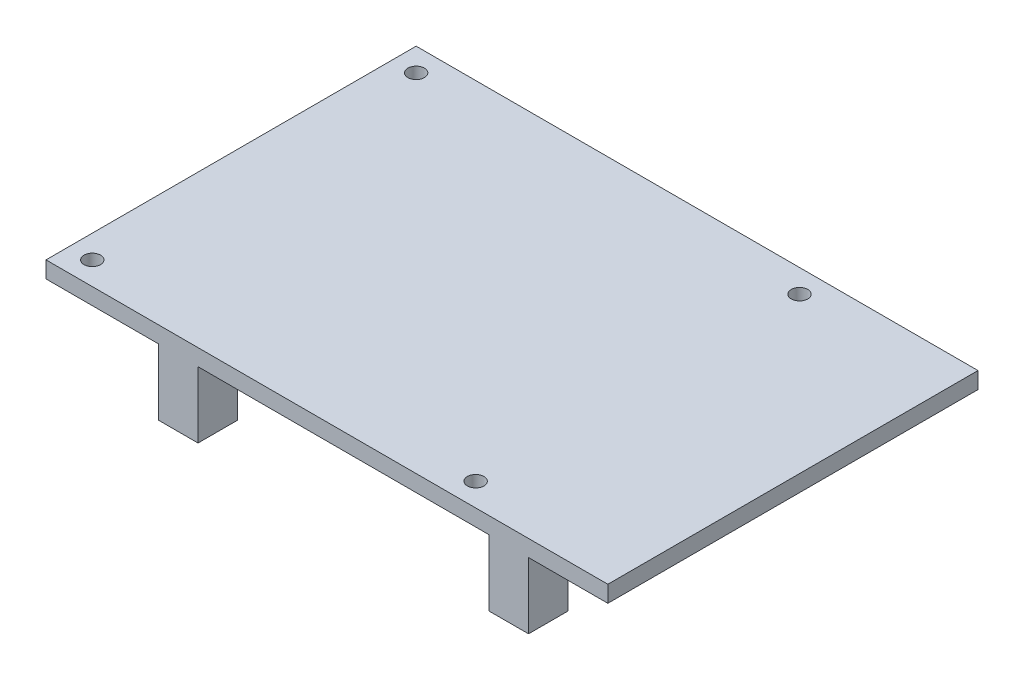
ISO-10303-21;
HEADER;
FILE_DESCRIPTION(('STEP AP214'),'2;1');
FILE_NAME('part.step','',(''),(''),'','','');
FILE_SCHEMA(('AUTOMOTIVE_DESIGN { 1 0 10303 214 1 1 1 1 }'));
ENDSEC;
DATA;
#1=APPLICATION_CONTEXT('core data for automotive mechanical design processes');
#2=APPLICATION_PROTOCOL_DEFINITION('international standard','automotive_design',2000,#1);
#3=PRODUCT_CONTEXT('',#1,'mechanical');
#4=PRODUCT('Part','Part','',(#3));
#5=PRODUCT_RELATED_PRODUCT_CATEGORY('part','',(#4));
#6=PRODUCT_DEFINITION_FORMATION('','',#4);
#7=PRODUCT_DEFINITION_CONTEXT('part definition',#1,'design');
#8=PRODUCT_DEFINITION('design','',#6,#7);
#9=PRODUCT_DEFINITION_SHAPE('','',#8);
#10=(LENGTH_UNIT() NAMED_UNIT(*) SI_UNIT(.MILLI.,.METRE.));
#11=(NAMED_UNIT(*) PLANE_ANGLE_UNIT() SI_UNIT($,.RADIAN.));
#12=(NAMED_UNIT(*) SI_UNIT($,.STERADIAN.) SOLID_ANGLE_UNIT());
#13=UNCERTAINTY_MEASURE_WITH_UNIT(LENGTH_MEASURE(1.E-05),#10,'distance_accuracy_value','');
#14=(GEOMETRIC_REPRESENTATION_CONTEXT(3) GLOBAL_UNCERTAINTY_ASSIGNED_CONTEXT((#13)) GLOBAL_UNIT_ASSIGNED_CONTEXT((#10,
#11,#12)) REPRESENTATION_CONTEXT('',''));
#15=CARTESIAN_POINT('',(0.,0.,0.));
#16=DIRECTION('',(0.,0.,1.));
#17=DIRECTION('',(1.,0.,0.));
#18=AXIS2_PLACEMENT_3D('',#15,#16,#17);
#19=CARTESIAN_POINT('',(0.,0.,0.));
#20=DIRECTION('',(0.,1.,0.));
#21=DIRECTION('',(0.,0.,1.));
#22=AXIS2_PLACEMENT_3D('',#19,#20,#21);
#23=PLANE('',#22);
#24=CARTESIAN_POINT('',(61.5,0.,3.5));
#25=DIRECTION('',(0.,1.,0.));
#26=DIRECTION('',(0.,0.,1.));
#27=AXIS2_PLACEMENT_3D('',#24,#25,#26);
#28=CIRCLE('',#27,1.25);
#29=CARTESIAN_POINT('',(61.5,0.,4.75));
#30=VERTEX_POINT('',#29);
#31=EDGE_CURVE('E391',#30,#30,#28,.T.);
#32=ORIENTED_EDGE('',*,*,#31,.T.);
#33=EDGE_LOOP('',(#32));
#34=FACE_BOUND('',#33,.T.);
#35=CARTESIAN_POINT('',(61.5,0.,52.5));
#36=DIRECTION('',(0.,1.,0.));
#37=DIRECTION('',(0.,0.,1.));
#38=AXIS2_PLACEMENT_3D('',#35,#36,#37);
#39=CIRCLE('',#38,1.25);
#40=CARTESIAN_POINT('',(61.5,0.,53.75));
#41=VERTEX_POINT('',#40);
#42=EDGE_CURVE('E399',#41,#41,#39,.T.);
#43=ORIENTED_EDGE('',*,*,#42,.T.);
#44=EDGE_LOOP('',(#43));
#45=FACE_BOUND('',#44,.T.);
#46=CARTESIAN_POINT('',(3.50000000000001,0.,52.5));
#47=DIRECTION('',(0.,1.,0.));
#48=DIRECTION('',(0.,0.,1.));
#49=AXIS2_PLACEMENT_3D('',#46,#47,#48);
#50=CIRCLE('',#49,1.25);
#51=CARTESIAN_POINT('',(3.50000000000001,0.,53.75));
#52=VERTEX_POINT('',#51);
#53=EDGE_CURVE('E407',#52,#52,#50,.T.);
#54=ORIENTED_EDGE('',*,*,#53,.T.);
#55=EDGE_LOOP('',(#54));
#56=FACE_BOUND('',#55,.T.);
#57=CARTESIAN_POINT('',(3.5,0.,3.5));
#58=DIRECTION('',(0.,1.,0.));
#59=DIRECTION('',(0.,0.,1.));
#60=AXIS2_PLACEMENT_3D('',#57,#58,#59);
#61=CIRCLE('',#60,1.25);
#62=CARTESIAN_POINT('',(3.5,0.,4.75));
#63=VERTEX_POINT('',#62);
#64=EDGE_CURVE('E415',#63,#63,#61,.T.);
#65=ORIENTED_EDGE('',*,*,#64,.T.);
#66=EDGE_LOOP('',(#65));
#67=FACE_BOUND('',#66,.T.);
#68=DIRECTION('',(1.,0.,0.));
#69=VECTOR('',#68,1.);
#70=CARTESIAN_POINT('',(0.,0.,56.));
#71=LINE('',#70,#69);
#72=CARTESIAN_POINT('',(23.,0.,56.));
#73=VERTEX_POINT('',#72);
#74=CARTESIAN_POINT('',(67.,0.,56.));
#75=VERTEX_POINT('',#74);
#76=EDGE_CURVE('E444',#73,#75,#71,.T.);
#77=ORIENTED_EDGE('',*,*,#76,.F.);
#78=DIRECTION('',(0.,0.,-1.));
#79=VECTOR('',#78,1.);
#80=CARTESIAN_POINT('',(23.,0.,0.));
#81=LINE('',#80,#79);
#82=CARTESIAN_POINT('',(23.,0.,50.));
#83=VERTEX_POINT('',#82);
#84=EDGE_CURVE('E113',#73,#83,#81,.T.);
#85=ORIENTED_EDGE('',*,*,#84,.T.);
#86=DIRECTION('',(1.,0.,0.));
#87=VECTOR('',#86,1.);
#88=CARTESIAN_POINT('',(0.,0.,50.));
#89=LINE('',#88,#87);
#90=CARTESIAN_POINT('',(17.,0.,50.));
#91=VERTEX_POINT('',#90);
#92=EDGE_CURVE('E293',#91,#83,#89,.T.);
#93=ORIENTED_EDGE('',*,*,#92,.F.);
#94=DIRECTION('',(0.,0.,-1.));
#95=VECTOR('',#94,1.);
#96=CARTESIAN_POINT('',(17.,0.,0.));
#97=LINE('',#96,#95);
#98=CARTESIAN_POINT('',(17.,0.,56.));
#99=VERTEX_POINT('',#98);
#100=EDGE_CURVE('E297',#99,#91,#97,.T.);
#101=ORIENTED_EDGE('',*,*,#100,.F.);
#102=CARTESIAN_POINT('',(0.,0.,56.));
#103=VERTEX_POINT('',#102);
#104=EDGE_CURVE('E439',#103,#99,#71,.T.);
#105=ORIENTED_EDGE('',*,*,#104,.F.);
#106=DIRECTION('',(0.,0.,1.));
#107=VECTOR('',#106,1.);
#108=CARTESIAN_POINT('',(0.,0.,0.));
#109=LINE('',#108,#107);
#110=CARTESIAN_POINT('',(0.,0.,0.));
#111=VERTEX_POINT('',#110);
#112=EDGE_CURVE('E419',#111,#103,#109,.T.);
#113=ORIENTED_EDGE('',*,*,#112,.F.);
#114=DIRECTION('',(-1.,0.,0.));
#115=VECTOR('',#114,1.);
#116=CARTESIAN_POINT('',(0.,0.,0.));
#117=LINE('',#116,#115);
#118=CARTESIAN_POINT('',(17.,0.,0.));
#119=VERTEX_POINT('',#118);
#120=EDGE_CURVE('E447',#119,#111,#117,.T.);
#121=ORIENTED_EDGE('',*,*,#120,.F.);
#122=DIRECTION('',(0.,0.,-1.));
#123=VECTOR('',#122,1.);
#124=CARTESIAN_POINT('',(17.,0.,0.));
#125=LINE('',#124,#123);
#126=CARTESIAN_POINT('',(17.,0.,5.99999999999999));
#127=VERTEX_POINT('',#126);
#128=EDGE_CURVE('E354',#127,#119,#125,.T.);
#129=ORIENTED_EDGE('',*,*,#128,.F.);
#130=DIRECTION('',(1.,0.,0.));
#131=VECTOR('',#130,1.);
#132=CARTESIAN_POINT('',(0.,0.,5.99999999999999));
#133=LINE('',#132,#131);
#134=CARTESIAN_POINT('',(23.,0.,5.99999999999999));
#135=VERTEX_POINT('',#134);
#136=EDGE_CURVE('E368',#127,#135,#133,.T.);
#137=ORIENTED_EDGE('',*,*,#136,.T.);
#138=DIRECTION('',(0.,0.,-1.));
#139=VECTOR('',#138,1.);
#140=CARTESIAN_POINT('',(23.,0.,0.));
#141=LINE('',#140,#139);
#142=CARTESIAN_POINT('',(23.,0.,0.));
#143=VERTEX_POINT('',#142);
#144=EDGE_CURVE('E304',#135,#143,#141,.T.);
#145=ORIENTED_EDGE('',*,*,#144,.T.);
#146=CARTESIAN_POINT('',(67.,0.,0.));
#147=VERTEX_POINT('',#146);
#148=EDGE_CURVE('E451',#147,#143,#117,.T.);
#149=ORIENTED_EDGE('',*,*,#148,.F.);
#150=DIRECTION('',(0.,0.,-1.));
#151=VECTOR('',#150,1.);
#152=CARTESIAN_POINT('',(67.,0.,6.));
#153=LINE('',#152,#151);
#154=CARTESIAN_POINT('',(67.,0.,6.));
#155=VERTEX_POINT('',#154);
#156=EDGE_CURVE('E326',#155,#147,#153,.T.);
#157=ORIENTED_EDGE('',*,*,#156,.F.);
#158=DIRECTION('',(1.,0.,0.));
#159=VECTOR('',#158,1.);
#160=CARTESIAN_POINT('',(67.,0.,6.));
#161=LINE('',#160,#159);
#162=CARTESIAN_POINT('',(73.,0.,5.99999999999999));
#163=VERTEX_POINT('',#162);
#164=EDGE_CURVE('E329',#155,#163,#161,.T.);
#165=ORIENTED_EDGE('',*,*,#164,.T.);
#166=DIRECTION('',(0.,0.,-1.));
#167=VECTOR('',#166,1.);
#168=CARTESIAN_POINT('',(73.,0.,5.99999999999999));
#169=LINE('',#168,#167);
#170=CARTESIAN_POINT('',(73.,0.,0.));
#171=VERTEX_POINT('',#170);
#172=EDGE_CURVE('E281',#163,#171,#169,.T.);
#173=ORIENTED_EDGE('',*,*,#172,.T.);
#174=CARTESIAN_POINT('',(85.,0.,0.));
#175=VERTEX_POINT('',#174);
#176=EDGE_CURVE('E425',#175,#171,#117,.T.);
#177=ORIENTED_EDGE('',*,*,#176,.F.);
#178=DIRECTION('',(0.,0.,-1.));
#179=VECTOR('',#178,1.);
#180=CARTESIAN_POINT('',(85.,0.,0.));
#181=LINE('',#180,#179);
#182=CARTESIAN_POINT('',(85.,0.,56.));
#183=VERTEX_POINT('',#182);
#184=EDGE_CURVE('E443',#183,#175,#181,.T.);
#185=ORIENTED_EDGE('',*,*,#184,.F.);
#186=CARTESIAN_POINT('',(73.,0.,56.));
#187=VERTEX_POINT('',#186);
#188=EDGE_CURVE('E438',#187,#183,#71,.T.);
#189=ORIENTED_EDGE('',*,*,#188,.F.);
#190=DIRECTION('',(0.,0.,-1.));
#191=VECTOR('',#190,1.);
#192=CARTESIAN_POINT('',(73.,0.,56.));
#193=LINE('',#192,#191);
#194=CARTESIAN_POINT('',(73.,0.,50.));
#195=VERTEX_POINT('',#194);
#196=EDGE_CURVE('E245',#187,#195,#193,.T.);
#197=ORIENTED_EDGE('',*,*,#196,.T.);
#198=DIRECTION('',(1.,0.,0.));
#199=VECTOR('',#198,1.);
#200=CARTESIAN_POINT('',(67.,0.,50.));
#201=LINE('',#200,#199);
#202=CARTESIAN_POINT('',(67.,0.,50.));
#203=VERTEX_POINT('',#202);
#204=EDGE_CURVE('E121',#203,#195,#201,.T.);
#205=ORIENTED_EDGE('',*,*,#204,.F.);
#206=DIRECTION('',(0.,0.,-1.));
#207=VECTOR('',#206,1.);
#208=CARTESIAN_POINT('',(67.,0.,56.));
#209=LINE('',#208,#207);
#210=EDGE_CURVE('E237',#75,#203,#209,.T.);
#211=ORIENTED_EDGE('',*,*,#210,.F.);
#212=EDGE_LOOP('',(#77,#85,#93,#101,#105,#113,#121,#129,#137,#145,#149,#157,#165,#173,#177,#185,
#189,#197,#205,#211));
#213=FACE_BOUND('',#212,.T.);
#214=ADVANCED_FACE('F97',(#34,#45,#56,#67,#213),#23,.F.);
#215=CARTESIAN_POINT('',(0.,2.5,0.));
#216=DIRECTION('',(1.,0.,0.));
#217=DIRECTION('',(0.,0.,-1.));
#218=AXIS2_PLACEMENT_3D('',#215,#216,#217);
#219=PLANE('',#218);
#220=ORIENTED_EDGE('',*,*,#112,.T.);
#221=DIRECTION('',(0.,-1.,0.));
#222=VECTOR('',#221,1.);
#223=CARTESIAN_POINT('',(0.,2.5,56.));
#224=LINE('',#223,#222);
#225=CARTESIAN_POINT('',(0.,2.5,56.));
#226=VERTEX_POINT('',#225);
#227=EDGE_CURVE('E12',#226,#103,#224,.T.);
#228=ORIENTED_EDGE('',*,*,#227,.F.);
#229=DIRECTION('',(0.,0.,1.));
#230=VECTOR('',#229,1.);
#231=CARTESIAN_POINT('',(0.,2.5,0.));
#232=LINE('',#231,#230);
#233=CARTESIAN_POINT('',(0.,2.5,0.));
#234=VERTEX_POINT('',#233);
#235=EDGE_CURVE('E420',#234,#226,#232,.T.);
#236=ORIENTED_EDGE('',*,*,#235,.F.);
#237=DIRECTION('',(0.,-1.,0.));
#238=VECTOR('',#237,1.);
#239=CARTESIAN_POINT('',(0.,2.5,0.));
#240=LINE('',#239,#238);
#241=EDGE_CURVE('E434',#234,#111,#240,.T.);
#242=ORIENTED_EDGE('',*,*,#241,.T.);
#243=EDGE_LOOP('',(#220,#228,#236,#242));
#244=FACE_BOUND('',#243,.T.);
#245=ADVANCED_FACE('F99',(#244),#219,.F.);
#246=CARTESIAN_POINT('',(0.,2.5,56.));
#247=DIRECTION('',(0.,0.,-1.));
#248=DIRECTION('',(-1.,0.,0.));
#249=AXIS2_PLACEMENT_3D('',#246,#247,#248);
#250=PLANE('',#249);
#251=ORIENTED_EDGE('',*,*,#104,.T.);
#252=DIRECTION('',(0.,1.,0.));
#253=VECTOR('',#252,1.);
#254=CARTESIAN_POINT('',(17.,-10.,56.));
#255=LINE('',#254,#253);
#256=CARTESIAN_POINT('',(17.,-10.,56.));
#257=VERTEX_POINT('',#256);
#258=EDGE_CURVE('E280',#257,#99,#255,.T.);
#259=ORIENTED_EDGE('',*,*,#258,.F.);
#260=DIRECTION('',(-1.,0.,0.));
#261=VECTOR('',#260,1.);
#262=CARTESIAN_POINT('',(0.,-10.,56.));
#263=LINE('',#262,#261);
#264=CARTESIAN_POINT('',(23.,-10.,56.));
#265=VERTEX_POINT('',#264);
#266=EDGE_CURVE('E310',#265,#257,#263,.T.);
#267=ORIENTED_EDGE('',*,*,#266,.F.);
#268=DIRECTION('',(0.,1.,0.));
#269=VECTOR('',#268,1.);
#270=CARTESIAN_POINT('',(23.,-10.,56.));
#271=LINE('',#270,#269);
#272=EDGE_CURVE('E276',#265,#73,#271,.T.);
#273=ORIENTED_EDGE('',*,*,#272,.T.);
#274=ORIENTED_EDGE('',*,*,#76,.T.);
#275=DIRECTION('',(0.,1.,0.));
#276=VECTOR('',#275,1.);
#277=CARTESIAN_POINT('',(67.,-10.,56.));
#278=LINE('',#277,#276);
#279=CARTESIAN_POINT('',(67.,-10.,56.));
#280=VERTEX_POINT('',#279);
#281=EDGE_CURVE('E242',#280,#75,#278,.T.);
#282=ORIENTED_EDGE('',*,*,#281,.F.);
#283=DIRECTION('',(1.,0.,0.));
#284=VECTOR('',#283,1.);
#285=CARTESIAN_POINT('',(67.,-10.,56.));
#286=LINE('',#285,#284);
#287=CARTESIAN_POINT('',(73.,-10.,56.));
#288=VERTEX_POINT('',#287);
#289=EDGE_CURVE('E266',#280,#288,#286,.T.);
#290=ORIENTED_EDGE('',*,*,#289,.T.);
#291=DIRECTION('',(0.,1.,0.));
#292=VECTOR('',#291,1.);
#293=CARTESIAN_POINT('',(73.,-10.,56.));
#294=LINE('',#293,#292);
#295=EDGE_CURVE('E827',#288,#187,#294,.T.);
#296=ORIENTED_EDGE('',*,*,#295,.T.);
#297=ORIENTED_EDGE('',*,*,#188,.T.);
#298=DIRECTION('',(0.,-1.,0.));
#299=VECTOR('',#298,1.);
#300=CARTESIAN_POINT('',(85.,2.5,56.));
#301=LINE('',#300,#299);
#302=CARTESIAN_POINT('',(85.,2.5,56.));
#303=VERTEX_POINT('',#302);
#304=EDGE_CURVE('E106',#303,#183,#301,.T.);
#305=ORIENTED_EDGE('',*,*,#304,.F.);
#306=DIRECTION('',(1.,0.,0.));
#307=VECTOR('',#306,1.);
#308=CARTESIAN_POINT('',(0.,2.5,56.));
#309=LINE('',#308,#307);
#310=EDGE_CURVE('E424',#226,#303,#309,.T.);
#311=ORIENTED_EDGE('',*,*,#310,.F.);
#312=ORIENTED_EDGE('',*,*,#227,.T.);
#313=EDGE_LOOP('',(#251,#259,#267,#273,#274,#282,#290,#296,#297,#305,#311,#312));
#314=FACE_BOUND('',#313,.T.);
#315=ADVANCED_FACE('F479',(#314),#250,.F.);
#316=CARTESIAN_POINT('',(85.,2.5,0.));
#317=DIRECTION('',(-1.,0.,0.));
#318=DIRECTION('',(0.,0.,1.));
#319=AXIS2_PLACEMENT_3D('',#316,#317,#318);
#320=PLANE('',#319);
#321=ORIENTED_EDGE('',*,*,#184,.T.);
#322=DIRECTION('',(0.,-1.,0.));
#323=VECTOR('',#322,1.);
#324=CARTESIAN_POINT('',(85.,2.5,0.));
#325=LINE('',#324,#323);
#326=CARTESIAN_POINT('',(85.,2.5,0.));
#327=VERTEX_POINT('',#326);
#328=EDGE_CURVE('E455',#327,#175,#325,.T.);
#329=ORIENTED_EDGE('',*,*,#328,.F.);
#330=DIRECTION('',(0.,0.,-1.));
#331=VECTOR('',#330,1.);
#332=CARTESIAN_POINT('',(85.,2.5,0.));
#333=LINE('',#332,#331);
#334=EDGE_CURVE('E428',#303,#327,#333,.T.);
#335=ORIENTED_EDGE('',*,*,#334,.F.);
#336=ORIENTED_EDGE('',*,*,#304,.T.);
#337=EDGE_LOOP('',(#321,#329,#335,#336));
#338=FACE_BOUND('',#337,.T.);
#339=ADVANCED_FACE('F464',(#338),#320,.F.);
#340=CARTESIAN_POINT('',(0.,2.5,0.));
#341=DIRECTION('',(0.,0.,1.));
#342=DIRECTION('',(1.,0.,0.));
#343=AXIS2_PLACEMENT_3D('',#340,#341,#342);
#344=PLANE('',#343);
#345=ORIENTED_EDGE('',*,*,#176,.T.);
#346=DIRECTION('',(0.,1.,0.));
#347=VECTOR('',#346,1.);
#348=CARTESIAN_POINT('',(73.,-10.,0.));
#349=LINE('',#348,#347);
#350=CARTESIAN_POINT('',(73.,-10.,0.));
#351=VERTEX_POINT('',#350);
#352=EDGE_CURVE('E256',#351,#171,#349,.T.);
#353=ORIENTED_EDGE('',*,*,#352,.F.);
#354=DIRECTION('',(1.,0.,0.));
#355=VECTOR('',#354,1.);
#356=CARTESIAN_POINT('',(67.,-10.,0.));
#357=LINE('',#356,#355);
#358=CARTESIAN_POINT('',(67.,-10.,0.));
#359=VERTEX_POINT('',#358);
#360=EDGE_CURVE('E330',#359,#351,#357,.T.);
#361=ORIENTED_EDGE('',*,*,#360,.F.);
#362=DIRECTION('',(0.,1.,0.));
#363=VECTOR('',#362,1.);
#364=CARTESIAN_POINT('',(67.,-10.,0.));
#365=LINE('',#364,#363);
#366=EDGE_CURVE('E321',#359,#147,#365,.T.);
#367=ORIENTED_EDGE('',*,*,#366,.T.);
#368=ORIENTED_EDGE('',*,*,#148,.T.);
#369=DIRECTION('',(0.,1.,0.));
#370=VECTOR('',#369,1.);
#371=CARTESIAN_POINT('',(23.,-10.,0.));
#372=LINE('',#371,#370);
#373=CARTESIAN_POINT('',(23.,-10.,0.));
#374=VERTEX_POINT('',#373);
#375=EDGE_CURVE('E364',#374,#143,#372,.T.);
#376=ORIENTED_EDGE('',*,*,#375,.F.);
#377=DIRECTION('',(1.,0.,0.));
#378=VECTOR('',#377,1.);
#379=CARTESIAN_POINT('',(0.,-10.,0.));
#380=LINE('',#379,#378);
#381=CARTESIAN_POINT('',(17.,-10.,0.));
#382=VERTEX_POINT('',#381);
#383=EDGE_CURVE('E361',#382,#374,#380,.T.);
#384=ORIENTED_EDGE('',*,*,#383,.F.);
#385=DIRECTION('',(0.,1.,0.));
#386=VECTOR('',#385,1.);
#387=CARTESIAN_POINT('',(17.,-10.,0.));
#388=LINE('',#387,#386);
#389=EDGE_CURVE('E376',#382,#119,#388,.T.);
#390=ORIENTED_EDGE('',*,*,#389,.T.);
#391=ORIENTED_EDGE('',*,*,#120,.T.);
#392=ORIENTED_EDGE('',*,*,#241,.F.);
#393=DIRECTION('',(-1.,0.,0.));
#394=VECTOR('',#393,1.);
#395=CARTESIAN_POINT('',(0.,2.5,0.));
#396=LINE('',#395,#394);
#397=EDGE_CURVE('E431',#327,#234,#396,.T.);
#398=ORIENTED_EDGE('',*,*,#397,.F.);
#399=ORIENTED_EDGE('',*,*,#328,.T.);
#400=EDGE_LOOP('',(#345,#353,#361,#367,#368,#376,#384,#390,#391,#392,#398,#399));
#401=FACE_BOUND('',#400,.T.);
#402=ADVANCED_FACE('F471',(#401),#344,.F.);
#403=CARTESIAN_POINT('',(0.,2.5,0.));
#404=DIRECTION('',(0.,1.,0.));
#405=DIRECTION('',(0.,0.,1.));
#406=AXIS2_PLACEMENT_3D('',#403,#404,#405);
#407=PLANE('',#406);
#408=CARTESIAN_POINT('',(61.5,2.5,3.5));
#409=DIRECTION('',(0.,1.,0.));
#410=DIRECTION('',(0.,0.,1.));
#411=AXIS2_PLACEMENT_3D('',#408,#409,#410);
#412=CIRCLE('',#411,1.24999999999999);
#413=CARTESIAN_POINT('',(61.5,2.5,4.74999999999999));
#414=VERTEX_POINT('',#413);
#415=EDGE_CURVE('E387',#414,#414,#412,.T.);
#416=ORIENTED_EDGE('',*,*,#415,.F.);
#417=EDGE_LOOP('',(#416));
#418=FACE_BOUND('',#417,.T.);
#419=CARTESIAN_POINT('',(61.5,2.5,52.5));
#420=DIRECTION('',(0.,1.,0.));
#421=DIRECTION('',(0.,0.,1.));
#422=AXIS2_PLACEMENT_3D('',#419,#420,#421);
#423=CIRCLE('',#422,1.24999999999999);
#424=CARTESIAN_POINT('',(61.5,2.5,53.75));
#425=VERTEX_POINT('',#424);
#426=EDGE_CURVE('E395',#425,#425,#423,.T.);
#427=ORIENTED_EDGE('',*,*,#426,.F.);
#428=EDGE_LOOP('',(#427));
#429=FACE_BOUND('',#428,.T.);
#430=CARTESIAN_POINT('',(3.50000000000001,2.5,52.5));
#431=DIRECTION('',(0.,1.,0.));
#432=DIRECTION('',(0.,0.,1.));
#433=AXIS2_PLACEMENT_3D('',#430,#431,#432);
#434=CIRCLE('',#433,1.24999999999999);
#435=CARTESIAN_POINT('',(3.50000000000001,2.5,53.75));
#436=VERTEX_POINT('',#435);
#437=EDGE_CURVE('E403',#436,#436,#434,.T.);
#438=ORIENTED_EDGE('',*,*,#437,.F.);
#439=EDGE_LOOP('',(#438));
#440=FACE_BOUND('',#439,.T.);
#441=CARTESIAN_POINT('',(3.5,2.5,3.5));
#442=DIRECTION('',(0.,1.,0.));
#443=DIRECTION('',(0.,0.,1.));
#444=AXIS2_PLACEMENT_3D('',#441,#442,#443);
#445=CIRCLE('',#444,1.24999999999999);
#446=CARTESIAN_POINT('',(3.5,2.5,4.74999999999999));
#447=VERTEX_POINT('',#446);
#448=EDGE_CURVE('E411',#447,#447,#445,.T.);
#449=ORIENTED_EDGE('',*,*,#448,.F.);
#450=EDGE_LOOP('',(#449));
#451=FACE_BOUND('',#450,.T.);
#452=ORIENTED_EDGE('',*,*,#235,.T.);
#453=ORIENTED_EDGE('',*,*,#310,.T.);
#454=ORIENTED_EDGE('',*,*,#334,.T.);
#455=ORIENTED_EDGE('',*,*,#397,.T.);
#456=EDGE_LOOP('',(#452,#453,#454,#455));
#457=FACE_BOUND('',#456,.T.);
#458=ADVANCED_FACE('F477',(#418,#429,#440,#451,#457),#407,.T.);
#459=CARTESIAN_POINT('',(3.5,2.5,3.5));
#460=DIRECTION('',(0.,1.,0.));
#461=DIRECTION('',(0.,0.,1.));
#462=AXIS2_PLACEMENT_3D('',#459,#460,#461);
#463=CYLINDRICAL_SURFACE('',#462,1.24999999999999);
#464=ORIENTED_EDGE('',*,*,#64,.F.);
#465=EDGE_LOOP('',(#464));
#466=FACE_BOUND('',#465,.T.);
#467=ORIENTED_EDGE('',*,*,#448,.T.);
#468=EDGE_LOOP('',(#467));
#469=FACE_BOUND('',#468,.T.);
#470=ADVANCED_FACE('F727',(#466,#469),#463,.F.);
#471=CARTESIAN_POINT('',(3.50000000000001,2.5,52.5));
#472=DIRECTION('',(0.,1.,0.));
#473=DIRECTION('',(0.,0.,1.));
#474=AXIS2_PLACEMENT_3D('',#471,#472,#473);
#475=CYLINDRICAL_SURFACE('',#474,1.24999999999999);
#476=ORIENTED_EDGE('',*,*,#53,.F.);
#477=EDGE_LOOP('',(#476));
#478=FACE_BOUND('',#477,.T.);
#479=ORIENTED_EDGE('',*,*,#437,.T.);
#480=EDGE_LOOP('',(#479));
#481=FACE_BOUND('',#480,.T.);
#482=ADVANCED_FACE('F717',(#478,#481),#475,.F.);
#483=CARTESIAN_POINT('',(61.5,2.5,52.5));
#484=DIRECTION('',(0.,1.,0.));
#485=DIRECTION('',(0.,0.,1.));
#486=AXIS2_PLACEMENT_3D('',#483,#484,#485);
#487=CYLINDRICAL_SURFACE('',#486,1.24999999999999);
#488=ORIENTED_EDGE('',*,*,#42,.F.);
#489=EDGE_LOOP('',(#488));
#490=FACE_BOUND('',#489,.T.);
#491=ORIENTED_EDGE('',*,*,#426,.T.);
#492=EDGE_LOOP('',(#491));
#493=FACE_BOUND('',#492,.T.);
#494=ADVANCED_FACE('F708',(#490,#493),#487,.F.);
#495=CARTESIAN_POINT('',(61.5,2.5,3.5));
#496=DIRECTION('',(0.,1.,0.));
#497=DIRECTION('',(0.,0.,1.));
#498=AXIS2_PLACEMENT_3D('',#495,#496,#497);
#499=CYLINDRICAL_SURFACE('',#498,1.24999999999999);
#500=ORIENTED_EDGE('',*,*,#31,.F.);
#501=EDGE_LOOP('',(#500));
#502=FACE_BOUND('',#501,.T.);
#503=ORIENTED_EDGE('',*,*,#415,.T.);
#504=EDGE_LOOP('',(#503));
#505=FACE_BOUND('',#504,.T.);
#506=ADVANCED_FACE('F542',(#502,#505),#499,.F.);
#507=CARTESIAN_POINT('',(0.,-10.,5.99999999999999));
#508=DIRECTION('',(0.,0.,1.));
#509=DIRECTION('',(1.,0.,0.));
#510=AXIS2_PLACEMENT_3D('',#507,#508,#509);
#511=PLANE('',#510);
#512=ORIENTED_EDGE('',*,*,#136,.F.);
#513=DIRECTION('',(0.,1.,0.));
#514=VECTOR('',#513,1.);
#515=CARTESIAN_POINT('',(17.,-10.,5.99999999999999));
#516=LINE('',#515,#514);
#517=CARTESIAN_POINT('',(17.,-10.,5.99999999999999));
#518=VERTEX_POINT('',#517);
#519=EDGE_CURVE('E380',#518,#127,#516,.T.);
#520=ORIENTED_EDGE('',*,*,#519,.F.);
#521=DIRECTION('',(1.,0.,0.));
#522=VECTOR('',#521,1.);
#523=CARTESIAN_POINT('',(0.,-10.,5.99999999999999));
#524=LINE('',#523,#522);
#525=CARTESIAN_POINT('',(23.,-10.,5.99999999999999));
#526=VERTEX_POINT('',#525);
#527=EDGE_CURVE('E353',#518,#526,#524,.T.);
#528=ORIENTED_EDGE('',*,*,#527,.T.);
#529=DIRECTION('',(0.,1.,0.));
#530=VECTOR('',#529,1.);
#531=CARTESIAN_POINT('',(23.,-10.,5.99999999999999));
#532=LINE('',#531,#530);
#533=EDGE_CURVE('E383',#526,#135,#532,.T.);
#534=ORIENTED_EDGE('',*,*,#533,.T.);
#535=EDGE_LOOP('',(#512,#520,#528,#534));
#536=FACE_BOUND('',#535,.T.);
#537=ADVANCED_FACE('F537',(#536),#511,.T.);
#538=CARTESIAN_POINT('',(17.,-10.,0.));
#539=DIRECTION('',(1.,0.,0.));
#540=DIRECTION('',(0.,0.,-1.));
#541=AXIS2_PLACEMENT_3D('',#538,#539,#540);
#542=PLANE('',#541);
#543=ORIENTED_EDGE('',*,*,#128,.T.);
#544=ORIENTED_EDGE('',*,*,#389,.F.);
#545=DIRECTION('',(0.,0.,-1.));
#546=VECTOR('',#545,1.);
#547=CARTESIAN_POINT('',(17.,-10.,0.));
#548=LINE('',#547,#546);
#549=EDGE_CURVE('E358',#518,#382,#548,.T.);
#550=ORIENTED_EDGE('',*,*,#549,.F.);
#551=ORIENTED_EDGE('',*,*,#519,.T.);
#552=EDGE_LOOP('',(#543,#544,#550,#551));
#553=FACE_BOUND('',#552,.T.);
#554=ADVANCED_FACE('F541',(#553),#542,.F.);
#555=CARTESIAN_POINT('',(23.,-10.,0.));
#556=DIRECTION('',(1.,0.,0.));
#557=DIRECTION('',(0.,0.,-1.));
#558=AXIS2_PLACEMENT_3D('',#555,#556,#557);
#559=PLANE('',#558);
#560=ORIENTED_EDGE('',*,*,#144,.F.);
#561=ORIENTED_EDGE('',*,*,#533,.F.);
#562=DIRECTION('',(0.,0.,-1.));
#563=VECTOR('',#562,1.);
#564=CARTESIAN_POINT('',(23.,-10.,0.));
#565=LINE('',#564,#563);
#566=EDGE_CURVE('E349',#526,#374,#565,.T.);
#567=ORIENTED_EDGE('',*,*,#566,.T.);
#568=ORIENTED_EDGE('',*,*,#375,.T.);
#569=EDGE_LOOP('',(#560,#561,#567,#568));
#570=FACE_BOUND('',#569,.T.);
#571=ADVANCED_FACE('F551',(#570),#559,.T.);
#572=CARTESIAN_POINT('',(0.,-10.,0.));
#573=DIRECTION('',(0.,-1.,0.));
#574=DIRECTION('',(0.,0.,-1.));
#575=AXIS2_PLACEMENT_3D('',#572,#573,#574);
#576=PLANE('',#575);
#577=ORIENTED_EDGE('',*,*,#566,.F.);
#578=ORIENTED_EDGE('',*,*,#527,.F.);
#579=ORIENTED_EDGE('',*,*,#549,.T.);
#580=ORIENTED_EDGE('',*,*,#383,.T.);
#581=EDGE_LOOP('',(#577,#578,#579,#580));
#582=FACE_BOUND('',#581,.T.);
#583=ADVANCED_FACE('F560',(#582),#576,.T.);
#584=CARTESIAN_POINT('',(67.,-10.,50.));
#585=DIRECTION('',(0.,0.,1.));
#586=DIRECTION('',(1.,0.,0.));
#587=AXIS2_PLACEMENT_3D('',#584,#585,#586);
#588=PLANE('',#587);
#589=ORIENTED_EDGE('',*,*,#204,.T.);
#590=DIRECTION('',(0.,1.,0.));
#591=VECTOR('',#590,1.);
#592=CARTESIAN_POINT('',(73.,-10.,50.));
#593=LINE('',#592,#591);
#594=CARTESIAN_POINT('',(73.,-10.,50.));
#595=VERTEX_POINT('',#594);
#596=EDGE_CURVE('E831',#595,#195,#593,.T.);
#597=ORIENTED_EDGE('',*,*,#596,.F.);
#598=DIRECTION('',(1.,0.,0.));
#599=VECTOR('',#598,1.);
#600=CARTESIAN_POINT('',(67.,-10.,50.));
#601=LINE('',#600,#599);
#602=CARTESIAN_POINT('',(67.,-10.,50.));
#603=VERTEX_POINT('',#602);
#604=EDGE_CURVE('E246',#603,#595,#601,.T.);
#605=ORIENTED_EDGE('',*,*,#604,.F.);
#606=DIRECTION('',(0.,1.,0.));
#607=VECTOR('',#606,1.);
#608=CARTESIAN_POINT('',(67.,-10.,50.));
#609=LINE('',#608,#607);
#610=EDGE_CURVE('E240',#603,#203,#609,.T.);
#611=ORIENTED_EDGE('',*,*,#610,.T.);
#612=EDGE_LOOP('',(#589,#597,#605,#611));
#613=FACE_BOUND('',#612,.T.);
#614=ADVANCED_FACE('F248',(#613),#588,.F.);
#615=CARTESIAN_POINT('',(73.,-10.,56.));
#616=DIRECTION('',(1.,0.,0.));
#617=DIRECTION('',(0.,0.,-1.));
#618=AXIS2_PLACEMENT_3D('',#615,#616,#617);
#619=PLANE('',#618);
#620=ORIENTED_EDGE('',*,*,#196,.F.);
#621=ORIENTED_EDGE('',*,*,#295,.F.);
#622=DIRECTION('',(0.,0.,-1.));
#623=VECTOR('',#622,1.);
#624=CARTESIAN_POINT('',(73.,-10.,56.));
#625=LINE('',#624,#623);
#626=EDGE_CURVE('E270',#288,#595,#625,.T.);
#627=ORIENTED_EDGE('',*,*,#626,.T.);
#628=ORIENTED_EDGE('',*,*,#596,.T.);
#629=EDGE_LOOP('',(#620,#621,#627,#628));
#630=FACE_BOUND('',#629,.T.);
#631=ADVANCED_FACE('F576',(#630),#619,.T.);
#632=CARTESIAN_POINT('',(67.,-10.,56.));
#633=DIRECTION('',(1.,0.,0.));
#634=DIRECTION('',(0.,0.,-1.));
#635=AXIS2_PLACEMENT_3D('',#632,#633,#634);
#636=PLANE('',#635);
#637=ORIENTED_EDGE('',*,*,#210,.T.);
#638=ORIENTED_EDGE('',*,*,#610,.F.);
#639=DIRECTION('',(0.,0.,-1.));
#640=VECTOR('',#639,1.);
#641=CARTESIAN_POINT('',(67.,-10.,56.));
#642=LINE('',#641,#640);
#643=EDGE_CURVE('E250',#280,#603,#642,.T.);
#644=ORIENTED_EDGE('',*,*,#643,.F.);
#645=ORIENTED_EDGE('',*,*,#281,.T.);
#646=EDGE_LOOP('',(#637,#638,#644,#645));
#647=FACE_BOUND('',#646,.T.);
#648=ADVANCED_FACE('F238',(#647),#636,.F.);
#649=CARTESIAN_POINT('',(0.,-10.,0.));
#650=DIRECTION('',(0.,1.,0.));
#651=DIRECTION('',(0.,0.,1.));
#652=AXIS2_PLACEMENT_3D('',#649,#650,#651);
#653=PLANE('',#652);
#654=ORIENTED_EDGE('',*,*,#604,.T.);
#655=ORIENTED_EDGE('',*,*,#626,.F.);
#656=ORIENTED_EDGE('',*,*,#289,.F.);
#657=ORIENTED_EDGE('',*,*,#643,.T.);
#658=EDGE_LOOP('',(#654,#655,#656,#657));
#659=FACE_BOUND('',#658,.T.);
#660=ADVANCED_FACE('F592',(#659),#653,.F.);
#661=CARTESIAN_POINT('',(73.,-10.,5.99999999999999));
#662=DIRECTION('',(1.,0.,0.));
#663=DIRECTION('',(0.,0.,-1.));
#664=AXIS2_PLACEMENT_3D('',#661,#662,#663);
#665=PLANE('',#664);
#666=ORIENTED_EDGE('',*,*,#172,.F.);
#667=DIRECTION('',(0.,1.,0.));
#668=VECTOR('',#667,1.);
#669=CARTESIAN_POINT('',(73.,-10.,5.99999999999999));
#670=LINE('',#669,#668);
#671=CARTESIAN_POINT('',(73.,-10.,5.99999999999999));
#672=VERTEX_POINT('',#671);
#673=EDGE_CURVE('E260',#672,#163,#670,.T.);
#674=ORIENTED_EDGE('',*,*,#673,.F.);
#675=DIRECTION('',(0.,0.,-1.));
#676=VECTOR('',#675,1.);
#677=CARTESIAN_POINT('',(73.,-10.,5.99999999999999));
#678=LINE('',#677,#676);
#679=EDGE_CURVE('E343',#672,#351,#678,.T.);
#680=ORIENTED_EDGE('',*,*,#679,.T.);
#681=ORIENTED_EDGE('',*,*,#352,.T.);
#682=EDGE_LOOP('',(#666,#674,#680,#681));
#683=FACE_BOUND('',#682,.T.);
#684=ADVANCED_FACE('F600',(#683),#665,.T.);
#685=CARTESIAN_POINT('',(67.,-10.,6.));
#686=DIRECTION('',(0.,0.,1.));
#687=DIRECTION('',(1.,0.,0.));
#688=AXIS2_PLACEMENT_3D('',#685,#686,#687);
#689=PLANE('',#688);
#690=ORIENTED_EDGE('',*,*,#164,.F.);
#691=DIRECTION('',(0.,1.,0.));
#692=VECTOR('',#691,1.);
#693=CARTESIAN_POINT('',(67.,-10.,6.));
#694=LINE('',#693,#692);
#695=CARTESIAN_POINT('',(67.,-10.,6.));
#696=VERTEX_POINT('',#695);
#697=EDGE_CURVE('E318',#696,#155,#694,.T.);
#698=ORIENTED_EDGE('',*,*,#697,.F.);
#699=DIRECTION('',(1.,0.,0.));
#700=VECTOR('',#699,1.);
#701=CARTESIAN_POINT('',(67.,-10.,6.));
#702=LINE('',#701,#700);
#703=EDGE_CURVE('E339',#696,#672,#702,.T.);
#704=ORIENTED_EDGE('',*,*,#703,.T.);
#705=ORIENTED_EDGE('',*,*,#673,.T.);
#706=EDGE_LOOP('',(#690,#698,#704,#705));
#707=FACE_BOUND('',#706,.T.);
#708=ADVANCED_FACE('F608',(#707),#689,.T.);
#709=CARTESIAN_POINT('',(67.,-10.,6.));
#710=DIRECTION('',(1.,0.,0.));
#711=DIRECTION('',(0.,0.,-1.));
#712=AXIS2_PLACEMENT_3D('',#709,#710,#711);
#713=PLANE('',#712);
#714=ORIENTED_EDGE('',*,*,#156,.T.);
#715=ORIENTED_EDGE('',*,*,#366,.F.);
#716=DIRECTION('',(0.,0.,-1.));
#717=VECTOR('',#716,1.);
#718=CARTESIAN_POINT('',(67.,-10.,6.));
#719=LINE('',#718,#717);
#720=EDGE_CURVE('E325',#696,#359,#719,.T.);
#721=ORIENTED_EDGE('',*,*,#720,.F.);
#722=ORIENTED_EDGE('',*,*,#697,.T.);
#723=EDGE_LOOP('',(#714,#715,#721,#722));
#724=FACE_BOUND('',#723,.T.);
#725=ADVANCED_FACE('F617',(#724),#713,.F.);
#726=CARTESIAN_POINT('',(0.,-10.,0.));
#727=DIRECTION('',(0.,1.,0.));
#728=DIRECTION('',(0.,0.,1.));
#729=AXIS2_PLACEMENT_3D('',#726,#727,#728);
#730=PLANE('',#729);
#731=ORIENTED_EDGE('',*,*,#360,.T.);
#732=ORIENTED_EDGE('',*,*,#679,.F.);
#733=ORIENTED_EDGE('',*,*,#703,.F.);
#734=ORIENTED_EDGE('',*,*,#720,.T.);
#735=EDGE_LOOP('',(#731,#732,#733,#734));
#736=FACE_BOUND('',#735,.T.);
#737=ADVANCED_FACE('F626',(#736),#730,.F.);
#738=CARTESIAN_POINT('',(17.,-10.,0.));
#739=DIRECTION('',(1.,0.,0.));
#740=DIRECTION('',(0.,0.,-1.));
#741=AXIS2_PLACEMENT_3D('',#738,#739,#740);
#742=PLANE('',#741);
#743=ORIENTED_EDGE('',*,*,#100,.T.);
#744=DIRECTION('',(0.,1.,0.));
#745=VECTOR('',#744,1.);
#746=CARTESIAN_POINT('',(17.,-10.,50.));
#747=LINE('',#746,#745);
#748=CARTESIAN_POINT('',(17.,-10.,50.));
#749=VERTEX_POINT('',#748);
#750=EDGE_CURVE('E285',#749,#91,#747,.T.);
#751=ORIENTED_EDGE('',*,*,#750,.F.);
#752=DIRECTION('',(0.,0.,-1.));
#753=VECTOR('',#752,1.);
#754=CARTESIAN_POINT('',(17.,-10.,0.));
#755=LINE('',#754,#753);
#756=EDGE_CURVE('E307',#257,#749,#755,.T.);
#757=ORIENTED_EDGE('',*,*,#756,.F.);
#758=ORIENTED_EDGE('',*,*,#258,.T.);
#759=EDGE_LOOP('',(#743,#751,#757,#758));
#760=FACE_BOUND('',#759,.T.);
#761=ADVANCED_FACE('F487',(#760),#742,.F.);
#762=CARTESIAN_POINT('',(0.,-10.,50.));
#763=DIRECTION('',(0.,0.,1.));
#764=DIRECTION('',(1.,0.,0.));
#765=AXIS2_PLACEMENT_3D('',#762,#763,#764);
#766=PLANE('',#765);
#767=ORIENTED_EDGE('',*,*,#92,.T.);
#768=DIRECTION('',(0.,1.,0.));
#769=VECTOR('',#768,1.);
#770=CARTESIAN_POINT('',(23.,-10.,50.));
#771=LINE('',#770,#769);
#772=CARTESIAN_POINT('',(23.,-10.,50.));
#773=VERTEX_POINT('',#772);
#774=EDGE_CURVE('E289',#773,#83,#771,.T.);
#775=ORIENTED_EDGE('',*,*,#774,.F.);
#776=DIRECTION('',(1.,0.,0.));
#777=VECTOR('',#776,1.);
#778=CARTESIAN_POINT('',(0.,-10.,50.));
#779=LINE('',#778,#777);
#780=EDGE_CURVE('E292',#749,#773,#779,.T.);
#781=ORIENTED_EDGE('',*,*,#780,.F.);
#782=ORIENTED_EDGE('',*,*,#750,.T.);
#783=EDGE_LOOP('',(#767,#775,#781,#782));
#784=FACE_BOUND('',#783,.T.);
#785=ADVANCED_FACE('F491',(#784),#766,.F.);
#786=CARTESIAN_POINT('',(23.,-10.,0.));
#787=DIRECTION('',(1.,0.,0.));
#788=DIRECTION('',(0.,0.,-1.));
#789=AXIS2_PLACEMENT_3D('',#786,#787,#788);
#790=PLANE('',#789);
#791=ORIENTED_EDGE('',*,*,#84,.F.);
#792=ORIENTED_EDGE('',*,*,#272,.F.);
#793=DIRECTION('',(0.,0.,-1.));
#794=VECTOR('',#793,1.);
#795=CARTESIAN_POINT('',(23.,-10.,0.));
#796=LINE('',#795,#794);
#797=EDGE_CURVE('E298',#265,#773,#796,.T.);
#798=ORIENTED_EDGE('',*,*,#797,.T.);
#799=ORIENTED_EDGE('',*,*,#774,.T.);
#800=EDGE_LOOP('',(#791,#792,#798,#799));
#801=FACE_BOUND('',#800,.T.);
#802=ADVANCED_FACE('F498',(#801),#790,.T.);
#803=CARTESIAN_POINT('',(0.,-10.,0.));
#804=DIRECTION('',(0.,-1.,0.));
#805=DIRECTION('',(0.,0.,-1.));
#806=AXIS2_PLACEMENT_3D('',#803,#804,#805);
#807=PLANE('',#806);
#808=ORIENTED_EDGE('',*,*,#797,.F.);
#809=ORIENTED_EDGE('',*,*,#266,.T.);
#810=ORIENTED_EDGE('',*,*,#756,.T.);
#811=ORIENTED_EDGE('',*,*,#780,.T.);
#812=EDGE_LOOP('',(#808,#809,#810,#811));
#813=FACE_BOUND('',#812,.T.);
#814=ADVANCED_FACE('F495',(#813),#807,.T.);
#815=CLOSED_SHELL('',(#214,#245,#315,#339,#402,#458,#470,#482,#494,#506,#537,#554,#571,#583,
#614,#631,#648,#660,#684,#708,#725,#737,#761,#785,#802,#814));
#816=MANIFOLD_SOLID_BREP('B2',#815);
#817=ADVANCED_BREP_SHAPE_REPRESENTATION('',(#18,#816),#14);
#818=SHAPE_DEFINITION_REPRESENTATION(#9,#817);
ENDSEC;
END-ISO-10303-21;
